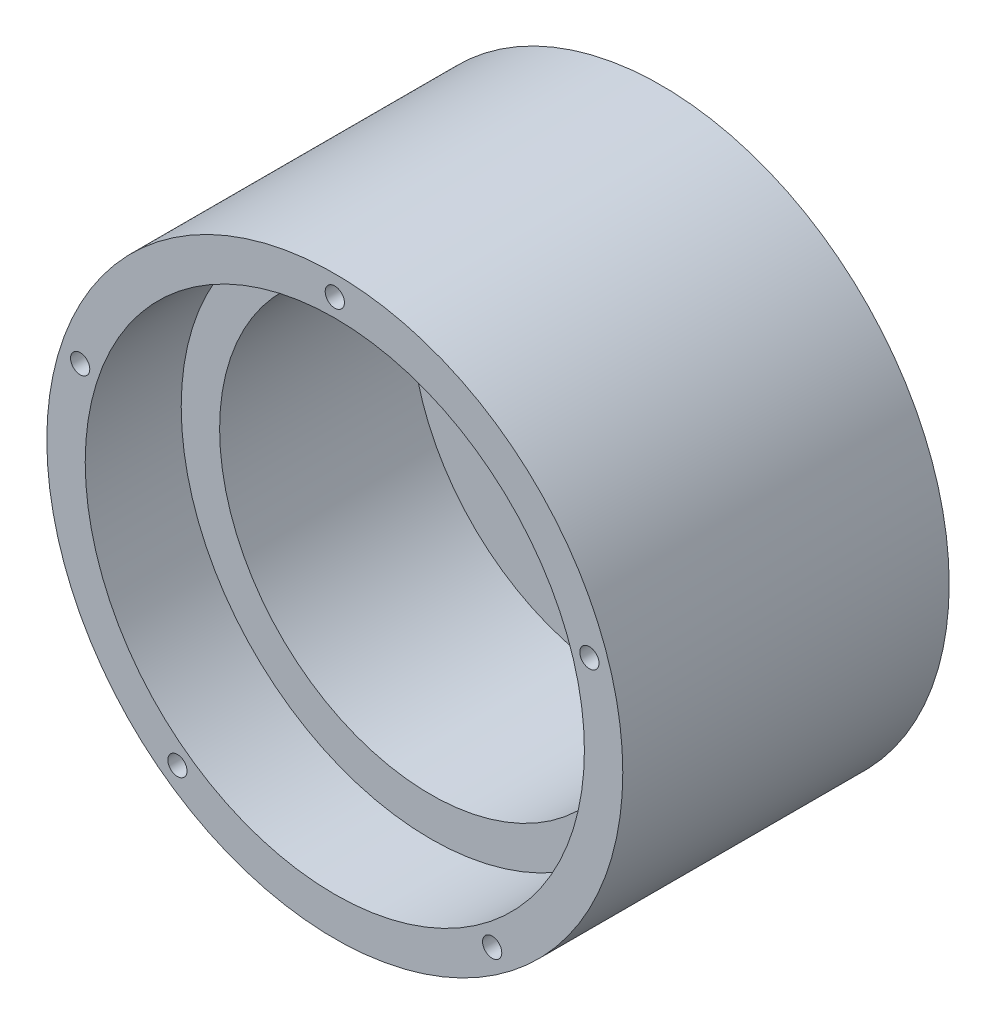
ISO-10303-21;
HEADER;
FILE_DESCRIPTION(('STEP AP214'),'2;1');
FILE_NAME('part.step','',(''),(''),'','','');
FILE_SCHEMA(('AUTOMOTIVE_DESIGN { 1 0 10303 214 1 1 1 1 }'));
ENDSEC;
DATA;
#1=APPLICATION_CONTEXT('core data for automotive mechanical design processes');
#2=APPLICATION_PROTOCOL_DEFINITION('international standard','automotive_design',2000,#1);
#3=PRODUCT_CONTEXT('',#1,'mechanical');
#4=PRODUCT('Part','Part','',(#3));
#5=PRODUCT_RELATED_PRODUCT_CATEGORY('part','',(#4));
#6=PRODUCT_DEFINITION_FORMATION('','',#4);
#7=PRODUCT_DEFINITION_CONTEXT('part definition',#1,'design');
#8=PRODUCT_DEFINITION('design','',#6,#7);
#9=PRODUCT_DEFINITION_SHAPE('','',#8);
#10=(LENGTH_UNIT() NAMED_UNIT(*) SI_UNIT(.MILLI.,.METRE.));
#11=(NAMED_UNIT(*) PLANE_ANGLE_UNIT() SI_UNIT($,.RADIAN.));
#12=(NAMED_UNIT(*) SI_UNIT($,.STERADIAN.) SOLID_ANGLE_UNIT());
#13=UNCERTAINTY_MEASURE_WITH_UNIT(LENGTH_MEASURE(1.E-05),#10,'distance_accuracy_value','');
#14=(GEOMETRIC_REPRESENTATION_CONTEXT(3) GLOBAL_UNCERTAINTY_ASSIGNED_CONTEXT((#13)) GLOBAL_UNIT_ASSIGNED_CONTEXT((#10,
#11,#12)) REPRESENTATION_CONTEXT('',''));
#15=CARTESIAN_POINT('',(0.,0.,0.));
#16=DIRECTION('',(0.,0.,1.));
#17=DIRECTION('',(1.,0.,0.));
#18=AXIS2_PLACEMENT_3D('',#15,#16,#17);
#19=CARTESIAN_POINT('',(0.,0.,85.));
#20=DIRECTION('',(0.,0.,-1.));
#21=DIRECTION('',(-1.,0.,0.));
#22=AXIS2_PLACEMENT_3D('',#19,#20,#21);
#23=CYLINDRICAL_SURFACE('',#22,75.);
#24=CARTESIAN_POINT('',(0.,0.,85.));
#25=DIRECTION('',(0.,0.,1.));
#26=DIRECTION('',(1.,0.,0.));
#27=AXIS2_PLACEMENT_3D('',#24,#25,#26);
#28=CIRCLE('',#27,75.);
#29=CARTESIAN_POINT('',(75.,0.,85.));
#30=VERTEX_POINT('',#29);
#31=EDGE_CURVE('E10',#30,#30,#28,.T.);
#32=ORIENTED_EDGE('',*,*,#31,.F.);
#33=EDGE_LOOP('',(#32));
#34=FACE_BOUND('',#33,.T.);
#35=CARTESIAN_POINT('',(0.,0.,0.));
#36=DIRECTION('',(0.,0.,1.));
#37=DIRECTION('',(1.,0.,0.));
#38=AXIS2_PLACEMENT_3D('',#35,#36,#37);
#39=CIRCLE('',#38,75.);
#40=CARTESIAN_POINT('',(75.,0.,0.));
#41=VERTEX_POINT('',#40);
#42=EDGE_CURVE('E46',#41,#41,#39,.T.);
#43=ORIENTED_EDGE('',*,*,#42,.T.);
#44=EDGE_LOOP('',(#43));
#45=FACE_BOUND('',#44,.T.);
#46=ADVANCED_FACE('F43',(#34,#45),#23,.T.);
#47=CARTESIAN_POINT('',(0.,0.,85.));
#48=DIRECTION('',(0.,0.,1.));
#49=DIRECTION('',(1.,0.,0.));
#50=AXIS2_PLACEMENT_3D('',#47,#48,#49);
#51=PLANE('',#50);
#52=CARTESIAN_POINT('',(-66.3108921391278,21.5457149307782,85.));
#53=DIRECTION('',(0.,0.,1.));
#54=DIRECTION('',(0.309016994374945,0.951056516295155,0.));
#55=AXIS2_PLACEMENT_3D('',#52,#53,#54);
#56=CIRCLE('',#55,2.5);
#57=CARTESIAN_POINT('',(-65.5383496531904,23.9233562215161,85.));
#58=VERTEX_POINT('',#57);
#59=EDGE_CURVE('E92',#58,#58,#56,.T.);
#60=ORIENTED_EDGE('',*,*,#59,.F.);
#61=EDGE_LOOP('',(#60));
#62=FACE_BOUND('',#61,.T.);
#63=CARTESIAN_POINT('',(-40.9823851663088,-56.4074140006941,85.));
#64=DIRECTION('',(0.,0.,1.));
#65=DIRECTION('',(-0.809016994374951,0.587785252292469,0.));
#66=AXIS2_PLACEMENT_3D('',#63,#64,#65);
#67=CIRCLE('',#66,2.5);
#68=CARTESIAN_POINT('',(-43.0049276522462,-54.937950869963,85.));
#69=VERTEX_POINT('',#68);
#70=EDGE_CURVE('E86',#69,#69,#67,.T.);
#71=ORIENTED_EDGE('',*,*,#70,.F.);
#72=EDGE_LOOP('',(#71));
#73=FACE_BOUND('',#72,.T.);
#74=CARTESIAN_POINT('',(40.9823851663096,-56.4074140006935,85.));
#75=DIRECTION('',(0.,0.,1.));
#76=DIRECTION('',(-0.809016994374942,-0.58778525229248,0.));
#77=AXIS2_PLACEMENT_3D('',#74,#75,#76);
#78=CIRCLE('',#77,2.5);
#79=CARTESIAN_POINT('',(38.9598426803723,-57.8768771314247,85.));
#80=VERTEX_POINT('',#79);
#81=EDGE_CURVE('E80',#80,#80,#78,.T.);
#82=ORIENTED_EDGE('',*,*,#81,.F.);
#83=EDGE_LOOP('',(#82));
#84=FACE_BOUND('',#83,.T.);
#85=CARTESIAN_POINT('',(66.3108921391275,21.5457149307791,85.));
#86=DIRECTION('',(0.,0.,1.));
#87=DIRECTION('',(0.309016994374958,-0.95105651629515,0.));
#88=AXIS2_PLACEMENT_3D('',#85,#86,#87);
#89=CIRCLE('',#88,2.5);
#90=CARTESIAN_POINT('',(67.0834346250649,19.1680736400413,85.));
#91=VERTEX_POINT('',#90);
#92=EDGE_CURVE('E73',#91,#91,#89,.T.);
#93=ORIENTED_EDGE('',*,*,#92,.F.);
#94=EDGE_LOOP('',(#93));
#95=FACE_BOUND('',#94,.T.);
#96=CARTESIAN_POINT('',(0.,69.723398139831,85.));
#97=DIRECTION('',(0.,0.,1.));
#98=DIRECTION('',(1.,0.,0.));
#99=AXIS2_PLACEMENT_3D('',#96,#97,#98);
#100=CIRCLE('',#99,2.5);
#101=CARTESIAN_POINT('',(2.5,69.723398139831,85.));
#102=VERTEX_POINT('',#101);
#103=EDGE_CURVE('E67',#102,#102,#100,.T.);
#104=ORIENTED_EDGE('',*,*,#103,.F.);
#105=EDGE_LOOP('',(#104));
#106=FACE_BOUND('',#105,.T.);
#107=CARTESIAN_POINT('',(0.,0.,85.));
#108=DIRECTION('',(0.,0.,1.));
#109=DIRECTION('',(1.,0.,0.));
#110=AXIS2_PLACEMENT_3D('',#107,#108,#109);
#111=CIRCLE('',#110,65.);
#112=CARTESIAN_POINT('',(65.,0.,85.));
#113=VERTEX_POINT('',#112);
#114=EDGE_CURVE('E55',#113,#113,#111,.T.);
#115=ORIENTED_EDGE('',*,*,#114,.F.);
#116=EDGE_LOOP('',(#115));
#117=FACE_BOUND('',#116,.T.);
#118=ORIENTED_EDGE('',*,*,#31,.T.);
#119=EDGE_LOOP('',(#118));
#120=FACE_BOUND('',#119,.T.);
#121=ADVANCED_FACE('F134',(#62,#73,#84,#95,#106,#117,#120),#51,.T.);
#122=CARTESIAN_POINT('',(0.,0.,0.));
#123=DIRECTION('',(0.,0.,1.));
#124=DIRECTION('',(1.,0.,0.));
#125=AXIS2_PLACEMENT_3D('',#122,#123,#124);
#126=PLANE('',#125);
#127=CARTESIAN_POINT('',(70.0778642936596,0.0778642936598545,0.));
#128=DIRECTION('',(0.,0.,-1.));
#129=DIRECTION('',(0.,-1.,0.));
#130=AXIS2_PLACEMENT_3D('',#127,#128,#129);
#131=CIRCLE('',#130,2.5);
#132=CARTESIAN_POINT('',(70.0778642936597,-2.42213570634015,0.));
#133=VERTEX_POINT('',#132);
#134=EDGE_CURVE('E115',#133,#133,#131,.T.);
#135=ORIENTED_EDGE('',*,*,#134,.F.);
#136=EDGE_LOOP('',(#135));
#137=FACE_BOUND('',#136,.T.);
#138=CARTESIAN_POINT('',(0.,70.1557285873192,0.));
#139=DIRECTION('',(0.,0.,-1.));
#140=DIRECTION('',(1.,0.,0.));
#141=AXIS2_PLACEMENT_3D('',#138,#139,#140);
#142=CIRCLE('',#141,2.5);
#143=CARTESIAN_POINT('',(2.50000000000003,70.1557285873192,0.));
#144=VERTEX_POINT('',#143);
#145=EDGE_CURVE('E109',#144,#144,#142,.T.);
#146=ORIENTED_EDGE('',*,*,#145,.F.);
#147=EDGE_LOOP('',(#146));
#148=FACE_BOUND('',#147,.T.);
#149=CARTESIAN_POINT('',(-70.0778642936596,0.0778642936589005,0.));
#150=DIRECTION('',(0.,0.,-1.));
#151=DIRECTION('',(0.,1.,0.));
#152=AXIS2_PLACEMENT_3D('',#149,#150,#151);
#153=CIRCLE('',#152,2.5);
#154=CARTESIAN_POINT('',(-70.0778642936596,2.5778642936589,0.));
#155=VERTEX_POINT('',#154);
#156=EDGE_CURVE('E103',#155,#155,#153,.T.);
#157=ORIENTED_EDGE('',*,*,#156,.F.);
#158=EDGE_LOOP('',(#157));
#159=FACE_BOUND('',#158,.T.);
#160=CARTESIAN_POINT('',(0.,-70.,0.));
#161=DIRECTION('',(0.,0.,-1.));
#162=DIRECTION('',(-1.,0.,0.));
#163=AXIS2_PLACEMENT_3D('',#160,#161,#162);
#164=CIRCLE('',#163,2.5);
#165=CARTESIAN_POINT('',(-2.5,-70.,0.));
#166=VERTEX_POINT('',#165);
#167=EDGE_CURVE('E97',#166,#166,#164,.T.);
#168=ORIENTED_EDGE('',*,*,#167,.F.);
#169=EDGE_LOOP('',(#168));
#170=FACE_BOUND('',#169,.T.);
#171=ORIENTED_EDGE('',*,*,#42,.F.);
#172=EDGE_LOOP('',(#171));
#173=FACE_BOUND('',#172,.T.);
#174=ADVANCED_FACE('F130',(#137,#148,#159,#170,#173),#126,.F.);
#175=CARTESIAN_POINT('',(0.,0.,60.));
#176=DIRECTION('',(0.,0.,1.));
#177=DIRECTION('',(1.,0.,0.));
#178=AXIS2_PLACEMENT_3D('',#175,#176,#177);
#179=CYLINDRICAL_SURFACE('',#178,65.);
#180=CARTESIAN_POINT('',(0.,0.,60.));
#181=DIRECTION('',(0.,0.,1.));
#182=DIRECTION('',(1.,0.,0.));
#183=AXIS2_PLACEMENT_3D('',#180,#181,#182);
#184=CIRCLE('',#183,65.);
#185=CARTESIAN_POINT('',(65.,0.,60.));
#186=VERTEX_POINT('',#185);
#187=EDGE_CURVE('E53',#186,#186,#184,.T.);
#188=ORIENTED_EDGE('',*,*,#187,.F.);
#189=EDGE_LOOP('',(#188));
#190=FACE_BOUND('',#189,.T.);
#191=ORIENTED_EDGE('',*,*,#114,.T.);
#192=EDGE_LOOP('',(#191));
#193=FACE_BOUND('',#192,.T.);
#194=ADVANCED_FACE('F133',(#190,#193),#179,.F.);
#195=CARTESIAN_POINT('',(0.,0.,60.));
#196=DIRECTION('',(0.,0.,1.));
#197=DIRECTION('',(1.,0.,0.));
#198=AXIS2_PLACEMENT_3D('',#195,#196,#197);
#199=PLANE('',#198);
#200=CARTESIAN_POINT('',(0.,0.,60.));
#201=DIRECTION('',(0.,0.,1.));
#202=DIRECTION('',(1.,0.,0.));
#203=AXIS2_PLACEMENT_3D('',#200,#201,#202);
#204=CIRCLE('',#203,55.);
#205=CARTESIAN_POINT('',(55.,0.,60.));
#206=VERTEX_POINT('',#205);
#207=EDGE_CURVE('E61',#206,#206,#204,.T.);
#208=ORIENTED_EDGE('',*,*,#207,.F.);
#209=EDGE_LOOP('',(#208));
#210=FACE_BOUND('',#209,.T.);
#211=ORIENTED_EDGE('',*,*,#187,.T.);
#212=EDGE_LOOP('',(#211));
#213=FACE_BOUND('',#212,.T.);
#214=ADVANCED_FACE('F157',(#210,#213),#199,.T.);
#215=CARTESIAN_POINT('',(0.,0.,10.));
#216=DIRECTION('',(0.,0.,1.));
#217=DIRECTION('',(1.,0.,0.));
#218=AXIS2_PLACEMENT_3D('',#215,#216,#217);
#219=CYLINDRICAL_SURFACE('',#218,55.);
#220=CARTESIAN_POINT('',(0.,0.,10.));
#221=DIRECTION('',(0.,0.,1.));
#222=DIRECTION('',(1.,0.,0.));
#223=AXIS2_PLACEMENT_3D('',#220,#221,#222);
#224=CIRCLE('',#223,55.);
#225=CARTESIAN_POINT('',(55.,0.,10.));
#226=VERTEX_POINT('',#225);
#227=EDGE_CURVE('E58',#226,#226,#224,.T.);
#228=ORIENTED_EDGE('',*,*,#227,.F.);
#229=EDGE_LOOP('',(#228));
#230=FACE_BOUND('',#229,.T.);
#231=ORIENTED_EDGE('',*,*,#207,.T.);
#232=EDGE_LOOP('',(#231));
#233=FACE_BOUND('',#232,.T.);
#234=ADVANCED_FACE('F161',(#230,#233),#219,.F.);
#235=CARTESIAN_POINT('',(0.,0.,10.));
#236=DIRECTION('',(0.,0.,1.));
#237=DIRECTION('',(1.,0.,0.));
#238=AXIS2_PLACEMENT_3D('',#235,#236,#237);
#239=PLANE('',#238);
#240=ORIENTED_EDGE('',*,*,#227,.T.);
#241=EDGE_LOOP('',(#240));
#242=FACE_BOUND('',#241,.T.);
#243=ADVANCED_FACE('F165',(#242),#239,.T.);
#244=CARTESIAN_POINT('',(0.,69.723398139831,65.));
#245=DIRECTION('',(0.,0.,1.));
#246=DIRECTION('',(1.,0.,0.));
#247=AXIS2_PLACEMENT_3D('',#244,#245,#246);
#248=CYLINDRICAL_SURFACE('',#247,2.5);
#249=CARTESIAN_POINT('',(0.,69.723398139831,65.));
#250=DIRECTION('',(0.,0.,1.));
#251=DIRECTION('',(1.,0.,0.));
#252=AXIS2_PLACEMENT_3D('',#249,#250,#251);
#253=CIRCLE('',#252,2.5);
#254=CARTESIAN_POINT('',(2.5,69.723398139831,65.));
#255=VERTEX_POINT('',#254);
#256=EDGE_CURVE('E64',#255,#255,#253,.T.);
#257=ORIENTED_EDGE('',*,*,#256,.F.);
#258=EDGE_LOOP('',(#257));
#259=FACE_BOUND('',#258,.T.);
#260=ORIENTED_EDGE('',*,*,#103,.T.);
#261=EDGE_LOOP('',(#260));
#262=FACE_BOUND('',#261,.T.);
#263=ADVANCED_FACE('F169',(#259,#262),#248,.F.);
#264=CARTESIAN_POINT('',(0.,69.723398139831,65.));
#265=DIRECTION('',(0.,0.,1.));
#266=DIRECTION('',(1.,0.,0.));
#267=AXIS2_PLACEMENT_3D('',#264,#265,#266);
#268=PLANE('',#267);
#269=ORIENTED_EDGE('',*,*,#256,.T.);
#270=EDGE_LOOP('',(#269));
#271=FACE_BOUND('',#270,.T.);
#272=ADVANCED_FACE('F173',(#271),#268,.T.);
#273=CARTESIAN_POINT('',(66.3108921391275,21.5457149307791,65.));
#274=DIRECTION('',(0.,0.,1.));
#275=DIRECTION('',(1.,0.,0.));
#276=AXIS2_PLACEMENT_3D('',#273,#274,#275);
#277=CYLINDRICAL_SURFACE('',#276,2.5);
#278=CARTESIAN_POINT('',(66.3108921391275,21.5457149307791,65.));
#279=DIRECTION('',(0.,0.,1.));
#280=DIRECTION('',(0.309016994374958,-0.95105651629515,0.));
#281=AXIS2_PLACEMENT_3D('',#278,#279,#280);
#282=CIRCLE('',#281,2.5);
#283=CARTESIAN_POINT('',(67.0834346250649,19.1680736400413,65.));
#284=VERTEX_POINT('',#283);
#285=EDGE_CURVE('E76',#284,#284,#282,.T.);
#286=ORIENTED_EDGE('',*,*,#285,.F.);
#287=EDGE_LOOP('',(#286));
#288=FACE_BOUND('',#287,.T.);
#289=ORIENTED_EDGE('',*,*,#92,.T.);
#290=EDGE_LOOP('',(#289));
#291=FACE_BOUND('',#290,.T.);
#292=ADVANCED_FACE('F177',(#288,#291),#277,.F.);
#293=CARTESIAN_POINT('',(66.3108921391275,21.5457149307791,65.));
#294=DIRECTION('',(0.,0.,1.));
#295=DIRECTION('',(0.309016994374958,-0.95105651629515,0.));
#296=AXIS2_PLACEMENT_3D('',#293,#294,#295);
#297=PLANE('',#296);
#298=ORIENTED_EDGE('',*,*,#285,.T.);
#299=EDGE_LOOP('',(#298));
#300=FACE_BOUND('',#299,.T.);
#301=ADVANCED_FACE('F181',(#300),#297,.T.);
#302=CARTESIAN_POINT('',(40.9823851663096,-56.4074140006935,65.));
#303=DIRECTION('',(0.,0.,1.));
#304=DIRECTION('',(1.,0.,0.));
#305=AXIS2_PLACEMENT_3D('',#302,#303,#304);
#306=CYLINDRICAL_SURFACE('',#305,2.5);
#307=CARTESIAN_POINT('',(40.9823851663096,-56.4074140006935,65.));
#308=DIRECTION('',(0.,0.,1.));
#309=DIRECTION('',(-0.809016994374942,-0.58778525229248,0.));
#310=AXIS2_PLACEMENT_3D('',#307,#308,#309);
#311=CIRCLE('',#310,2.5);
#312=CARTESIAN_POINT('',(38.9598426803723,-57.8768771314247,65.));
#313=VERTEX_POINT('',#312);
#314=EDGE_CURVE('E83',#313,#313,#311,.T.);
#315=ORIENTED_EDGE('',*,*,#314,.F.);
#316=EDGE_LOOP('',(#315));
#317=FACE_BOUND('',#316,.T.);
#318=ORIENTED_EDGE('',*,*,#81,.T.);
#319=EDGE_LOOP('',(#318));
#320=FACE_BOUND('',#319,.T.);
#321=ADVANCED_FACE('F185',(#317,#320),#306,.F.);
#322=CARTESIAN_POINT('',(40.9823851663096,-56.4074140006935,65.));
#323=DIRECTION('',(0.,0.,1.));
#324=DIRECTION('',(-0.809016994374942,-0.58778525229248,0.));
#325=AXIS2_PLACEMENT_3D('',#322,#323,#324);
#326=PLANE('',#325);
#327=ORIENTED_EDGE('',*,*,#314,.T.);
#328=EDGE_LOOP('',(#327));
#329=FACE_BOUND('',#328,.T.);
#330=ADVANCED_FACE('F189',(#329),#326,.T.);
#331=CARTESIAN_POINT('',(-40.9823851663088,-56.4074140006941,65.));
#332=DIRECTION('',(0.,0.,1.));
#333=DIRECTION('',(1.,0.,0.));
#334=AXIS2_PLACEMENT_3D('',#331,#332,#333);
#335=CYLINDRICAL_SURFACE('',#334,2.5);
#336=CARTESIAN_POINT('',(-40.9823851663088,-56.4074140006941,65.));
#337=DIRECTION('',(0.,0.,1.));
#338=DIRECTION('',(-0.809016994374951,0.587785252292469,0.));
#339=AXIS2_PLACEMENT_3D('',#336,#337,#338);
#340=CIRCLE('',#339,2.5);
#341=CARTESIAN_POINT('',(-43.0049276522462,-54.937950869963,65.));
#342=VERTEX_POINT('',#341);
#343=EDGE_CURVE('E89',#342,#342,#340,.T.);
#344=ORIENTED_EDGE('',*,*,#343,.F.);
#345=EDGE_LOOP('',(#344));
#346=FACE_BOUND('',#345,.T.);
#347=ORIENTED_EDGE('',*,*,#70,.T.);
#348=EDGE_LOOP('',(#347));
#349=FACE_BOUND('',#348,.T.);
#350=ADVANCED_FACE('F193',(#346,#349),#335,.F.);
#351=CARTESIAN_POINT('',(-40.9823851663088,-56.4074140006941,65.));
#352=DIRECTION('',(0.,0.,1.));
#353=DIRECTION('',(-0.809016994374951,0.587785252292469,0.));
#354=AXIS2_PLACEMENT_3D('',#351,#352,#353);
#355=PLANE('',#354);
#356=ORIENTED_EDGE('',*,*,#343,.T.);
#357=EDGE_LOOP('',(#356));
#358=FACE_BOUND('',#357,.T.);
#359=ADVANCED_FACE('F197',(#358),#355,.T.);
#360=CARTESIAN_POINT('',(-66.3108921391278,21.5457149307782,65.));
#361=DIRECTION('',(0.,0.,1.));
#362=DIRECTION('',(1.,0.,0.));
#363=AXIS2_PLACEMENT_3D('',#360,#361,#362);
#364=CYLINDRICAL_SURFACE('',#363,2.5);
#365=CARTESIAN_POINT('',(-66.3108921391278,21.5457149307782,65.));
#366=DIRECTION('',(0.,0.,1.));
#367=DIRECTION('',(0.309016994374945,0.951056516295155,0.));
#368=AXIS2_PLACEMENT_3D('',#365,#366,#367);
#369=CIRCLE('',#368,2.5);
#370=CARTESIAN_POINT('',(-65.5383496531904,23.9233562215161,65.));
#371=VERTEX_POINT('',#370);
#372=EDGE_CURVE('E70',#371,#371,#369,.T.);
#373=ORIENTED_EDGE('',*,*,#372,.F.);
#374=EDGE_LOOP('',(#373));
#375=FACE_BOUND('',#374,.T.);
#376=ORIENTED_EDGE('',*,*,#59,.T.);
#377=EDGE_LOOP('',(#376));
#378=FACE_BOUND('',#377,.T.);
#379=ADVANCED_FACE('F201',(#375,#378),#364,.F.);
#380=CARTESIAN_POINT('',(-66.3108921391278,21.5457149307782,65.));
#381=DIRECTION('',(0.,0.,1.));
#382=DIRECTION('',(0.309016994374945,0.951056516295155,0.));
#383=AXIS2_PLACEMENT_3D('',#380,#381,#382);
#384=PLANE('',#383);
#385=ORIENTED_EDGE('',*,*,#372,.T.);
#386=EDGE_LOOP('',(#385));
#387=FACE_BOUND('',#386,.T.);
#388=ADVANCED_FACE('F205',(#387),#384,.T.);
#389=CARTESIAN_POINT('',(0.,-70.,10.));
#390=DIRECTION('',(0.,0.,-1.));
#391=DIRECTION('',(-1.,0.,0.));
#392=AXIS2_PLACEMENT_3D('',#389,#390,#391);
#393=CYLINDRICAL_SURFACE('',#392,2.5);
#394=CARTESIAN_POINT('',(0.,-70.,10.));
#395=DIRECTION('',(0.,0.,-1.));
#396=DIRECTION('',(-1.,0.,0.));
#397=AXIS2_PLACEMENT_3D('',#394,#395,#396);
#398=CIRCLE('',#397,2.5);
#399=CARTESIAN_POINT('',(-2.5,-70.,10.));
#400=VERTEX_POINT('',#399);
#401=EDGE_CURVE('E77',#400,#400,#398,.T.);
#402=ORIENTED_EDGE('',*,*,#401,.F.);
#403=EDGE_LOOP('',(#402));
#404=FACE_BOUND('',#403,.T.);
#405=ORIENTED_EDGE('',*,*,#167,.T.);
#406=EDGE_LOOP('',(#405));
#407=FACE_BOUND('',#406,.T.);
#408=ADVANCED_FACE('F209',(#404,#407),#393,.F.);
#409=CARTESIAN_POINT('',(0.,-70.,10.));
#410=DIRECTION('',(0.,0.,-1.));
#411=DIRECTION('',(-1.,0.,0.));
#412=AXIS2_PLACEMENT_3D('',#409,#410,#411);
#413=PLANE('',#412);
#414=ORIENTED_EDGE('',*,*,#401,.T.);
#415=EDGE_LOOP('',(#414));
#416=FACE_BOUND('',#415,.T.);
#417=ADVANCED_FACE('F213',(#416),#413,.T.);
#418=CARTESIAN_POINT('',(-70.0778642936596,0.0778642936589005,10.));
#419=DIRECTION('',(0.,0.,-1.));
#420=DIRECTION('',(-1.,0.,0.));
#421=AXIS2_PLACEMENT_3D('',#418,#419,#420);
#422=CYLINDRICAL_SURFACE('',#421,2.5);
#423=CARTESIAN_POINT('',(-70.0778642936596,0.0778642936589005,10.));
#424=DIRECTION('',(0.,0.,-1.));
#425=DIRECTION('',(0.,1.,0.));
#426=AXIS2_PLACEMENT_3D('',#423,#424,#425);
#427=CIRCLE('',#426,2.5);
#428=CARTESIAN_POINT('',(-70.0778642936596,2.5778642936589,10.));
#429=VERTEX_POINT('',#428);
#430=EDGE_CURVE('E106',#429,#429,#427,.T.);
#431=ORIENTED_EDGE('',*,*,#430,.F.);
#432=EDGE_LOOP('',(#431));
#433=FACE_BOUND('',#432,.T.);
#434=ORIENTED_EDGE('',*,*,#156,.T.);
#435=EDGE_LOOP('',(#434));
#436=FACE_BOUND('',#435,.T.);
#437=ADVANCED_FACE('F217',(#433,#436),#422,.F.);
#438=CARTESIAN_POINT('',(-70.0778642936596,0.0778642936589005,10.));
#439=DIRECTION('',(0.,0.,-1.));
#440=DIRECTION('',(0.,1.,0.));
#441=AXIS2_PLACEMENT_3D('',#438,#439,#440);
#442=PLANE('',#441);
#443=ORIENTED_EDGE('',*,*,#430,.T.);
#444=EDGE_LOOP('',(#443));
#445=FACE_BOUND('',#444,.T.);
#446=ADVANCED_FACE('F221',(#445),#442,.T.);
#447=CARTESIAN_POINT('',(0.,70.1557285873192,10.));
#448=DIRECTION('',(0.,0.,-1.));
#449=DIRECTION('',(-1.,0.,0.));
#450=AXIS2_PLACEMENT_3D('',#447,#448,#449);
#451=CYLINDRICAL_SURFACE('',#450,2.5);
#452=CARTESIAN_POINT('',(0.,70.1557285873192,10.));
#453=DIRECTION('',(0.,0.,-1.));
#454=DIRECTION('',(1.,0.,0.));
#455=AXIS2_PLACEMENT_3D('',#452,#453,#454);
#456=CIRCLE('',#455,2.5);
#457=CARTESIAN_POINT('',(2.50000000000003,70.1557285873192,10.));
#458=VERTEX_POINT('',#457);
#459=EDGE_CURVE('E112',#458,#458,#456,.T.);
#460=ORIENTED_EDGE('',*,*,#459,.F.);
#461=EDGE_LOOP('',(#460));
#462=FACE_BOUND('',#461,.T.);
#463=ORIENTED_EDGE('',*,*,#145,.T.);
#464=EDGE_LOOP('',(#463));
#465=FACE_BOUND('',#464,.T.);
#466=ADVANCED_FACE('F225',(#462,#465),#451,.F.);
#467=CARTESIAN_POINT('',(0.,70.1557285873192,10.));
#468=DIRECTION('',(0.,0.,-1.));
#469=DIRECTION('',(1.,0.,0.));
#470=AXIS2_PLACEMENT_3D('',#467,#468,#469);
#471=PLANE('',#470);
#472=ORIENTED_EDGE('',*,*,#459,.T.);
#473=EDGE_LOOP('',(#472));
#474=FACE_BOUND('',#473,.T.);
#475=ADVANCED_FACE('F126',(#474),#471,.T.);
#476=CARTESIAN_POINT('',(70.0778642936596,0.0778642936598545,10.));
#477=DIRECTION('',(0.,0.,-1.));
#478=DIRECTION('',(-1.,0.,0.));
#479=AXIS2_PLACEMENT_3D('',#476,#477,#478);
#480=CYLINDRICAL_SURFACE('',#479,2.5);
#481=CARTESIAN_POINT('',(70.0778642936596,0.0778642936598545,10.));
#482=DIRECTION('',(0.,0.,-1.));
#483=DIRECTION('',(0.,-1.,0.));
#484=AXIS2_PLACEMENT_3D('',#481,#482,#483);
#485=CIRCLE('',#484,2.5);
#486=CARTESIAN_POINT('',(70.0778642936597,-2.42213570634015,10.));
#487=VERTEX_POINT('',#486);
#488=EDGE_CURVE('E100',#487,#487,#485,.T.);
#489=ORIENTED_EDGE('',*,*,#488,.F.);
#490=EDGE_LOOP('',(#489));
#491=FACE_BOUND('',#490,.T.);
#492=ORIENTED_EDGE('',*,*,#134,.T.);
#493=EDGE_LOOP('',(#492));
#494=FACE_BOUND('',#493,.T.);
#495=ADVANCED_FACE('F123',(#491,#494),#480,.F.);
#496=CARTESIAN_POINT('',(70.0778642936596,0.0778642936598545,10.));
#497=DIRECTION('',(0.,0.,-1.));
#498=DIRECTION('',(0.,-1.,0.));
#499=AXIS2_PLACEMENT_3D('',#496,#497,#498);
#500=PLANE('',#499);
#501=ORIENTED_EDGE('',*,*,#488,.T.);
#502=EDGE_LOOP('',(#501));
#503=FACE_BOUND('',#502,.T.);
#504=ADVANCED_FACE('F121',(#503),#500,.T.);
#505=CLOSED_SHELL('',(#46,#121,#174,#194,#214,#234,#243,#263,#272,#292,#301,#321,#330,#350,#359,
#379,#388,#408,#417,#437,#446,#466,#475,#495,#504));
#506=MANIFOLD_SOLID_BREP('B2',#505);
#507=ADVANCED_BREP_SHAPE_REPRESENTATION('',(#18,#506),#14);
#508=SHAPE_DEFINITION_REPRESENTATION(#9,#507);
ENDSEC;
END-ISO-10303-21;
